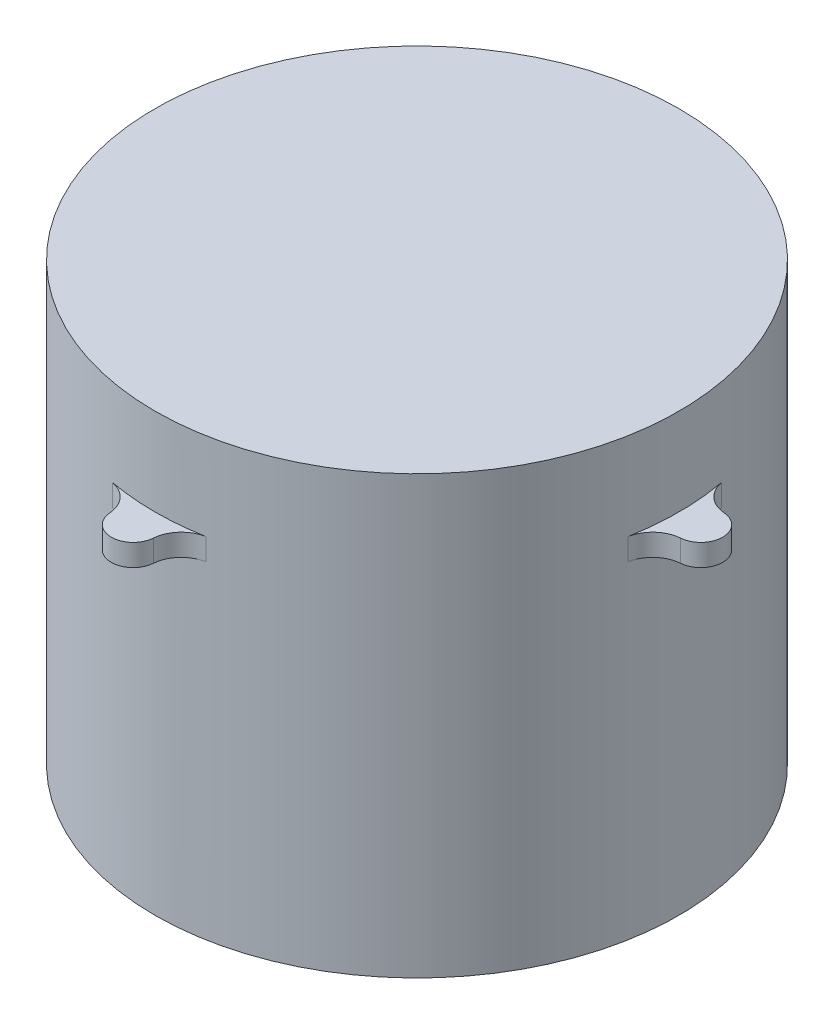
ISO-10303-21;
HEADER;
FILE_DESCRIPTION(('STEP AP214'),'2;1');
FILE_NAME('part.step','',(''),(''),'','','');
FILE_SCHEMA(('AUTOMOTIVE_DESIGN { 1 0 10303 214 1 1 1 1 }'));
ENDSEC;
DATA;
#1=APPLICATION_CONTEXT('core data for automotive mechanical design processes');
#2=APPLICATION_PROTOCOL_DEFINITION('international standard','automotive_design',2000,#1);
#3=PRODUCT_CONTEXT('',#1,'mechanical');
#4=PRODUCT('Part','Part','',(#3));
#5=PRODUCT_RELATED_PRODUCT_CATEGORY('part','',(#4));
#6=PRODUCT_DEFINITION_FORMATION('','',#4);
#7=PRODUCT_DEFINITION_CONTEXT('part definition',#1,'design');
#8=PRODUCT_DEFINITION('design','',#6,#7);
#9=PRODUCT_DEFINITION_SHAPE('','',#8);
#10=(LENGTH_UNIT() NAMED_UNIT(*) SI_UNIT(.MILLI.,.METRE.));
#11=(NAMED_UNIT(*) PLANE_ANGLE_UNIT() SI_UNIT($,.RADIAN.));
#12=(NAMED_UNIT(*) SI_UNIT($,.STERADIAN.) SOLID_ANGLE_UNIT());
#13=UNCERTAINTY_MEASURE_WITH_UNIT(LENGTH_MEASURE(1.E-05),#10,'distance_accuracy_value','');
#14=(GEOMETRIC_REPRESENTATION_CONTEXT(3) GLOBAL_UNCERTAINTY_ASSIGNED_CONTEXT((#13)) GLOBAL_UNIT_ASSIGNED_CONTEXT((#10,
#11,#12)) REPRESENTATION_CONTEXT('',''));
#15=CARTESIAN_POINT('',(0.,0.,0.));
#16=DIRECTION('',(0.,0.,1.));
#17=DIRECTION('',(1.,0.,0.));
#18=AXIS2_PLACEMENT_3D('',#15,#16,#17);
#19=CARTESIAN_POINT('',(0.,100.,0.));
#20=DIRECTION('',(0.,-1.,0.));
#21=DIRECTION('',(0.,0.,-1.));
#22=AXIS2_PLACEMENT_3D('',#19,#20,#21);
#23=CYLINDRICAL_SURFACE('',#22,60.);
#24=CARTESIAN_POINT('',(0.,75.,0.));
#25=DIRECTION('',(0.,1.,0.));
#26=DIRECTION('',(0.,0.,1.));
#27=AXIS2_PLACEMENT_3D('',#24,#25,#26);
#28=CIRCLE('',#27,60.);
#29=CARTESIAN_POINT('',(59.0355912743972,75.,10.7144277907087));
#30=VERTEX_POINT('',#29);
#31=CARTESIAN_POINT('',(59.0355912743972,75.,-10.7144277907088));
#32=VERTEX_POINT('',#31);
#33=EDGE_CURVE('E11',#30,#32,#28,.T.);
#34=ORIENTED_EDGE('',*,*,#33,.F.);
#35=DIRECTION('',(0.,1.,0.));
#36=VECTOR('',#35,1.);
#37=CARTESIAN_POINT('',(59.0355912743972,75.,10.7144277907087));
#38=LINE('',#37,#36);
#39=CARTESIAN_POINT('',(59.0355912743972,80.,10.7144277907087));
#40=VERTEX_POINT('',#39);
#41=EDGE_CURVE('E322',#30,#40,#38,.T.);
#42=ORIENTED_EDGE('',*,*,#41,.T.);
#43=CARTESIAN_POINT('',(0.,80.,0.));
#44=DIRECTION('',(0.,1.,0.));
#45=DIRECTION('',(0.,0.,1.));
#46=AXIS2_PLACEMENT_3D('',#43,#44,#45);
#47=CIRCLE('',#46,60.);
#48=CARTESIAN_POINT('',(59.0355912743972,80.,-10.7144277907088));
#49=VERTEX_POINT('',#48);
#50=EDGE_CURVE('E207',#40,#49,#47,.T.);
#51=ORIENTED_EDGE('',*,*,#50,.T.);
#52=DIRECTION('',(0.,1.,0.));
#53=VECTOR('',#52,1.);
#54=CARTESIAN_POINT('',(59.0355912743972,75.,-10.7144277907088));
#55=LINE('',#54,#53);
#56=EDGE_CURVE('E313',#32,#49,#55,.T.);
#57=ORIENTED_EDGE('',*,*,#56,.F.);
#58=EDGE_LOOP('',(#34,#42,#51,#57));
#59=FACE_BOUND('',#58,.T.);
#60=CARTESIAN_POINT('',(10.7144277907087,75.,-59.0355912743972));
#61=VERTEX_POINT('',#60);
#62=CARTESIAN_POINT('',(-10.7144277907087,75.,-59.0355912743972));
#63=VERTEX_POINT('',#62);
#64=EDGE_CURVE('E54',#61,#63,#28,.T.);
#65=ORIENTED_EDGE('',*,*,#64,.F.);
#66=DIRECTION('',(0.,1.,0.));
#67=VECTOR('',#66,1.);
#68=CARTESIAN_POINT('',(10.7144277907087,75.,-59.0355912743972));
#69=LINE('',#68,#67);
#70=CARTESIAN_POINT('',(10.7144277907087,80.,-59.0355912743972));
#71=VERTEX_POINT('',#70);
#72=EDGE_CURVE('E310',#61,#71,#69,.T.);
#73=ORIENTED_EDGE('',*,*,#72,.T.);
#74=CARTESIAN_POINT('',(-10.7144277907087,80.,-59.0355912743972));
#75=VERTEX_POINT('',#74);
#76=EDGE_CURVE('E183',#71,#75,#47,.T.);
#77=ORIENTED_EDGE('',*,*,#76,.T.);
#78=DIRECTION('',(0.,1.,0.));
#79=VECTOR('',#78,1.);
#80=CARTESIAN_POINT('',(-10.7144277907087,75.,-59.0355912743972));
#81=LINE('',#80,#79);
#82=EDGE_CURVE('E175',#63,#75,#81,.T.);
#83=ORIENTED_EDGE('',*,*,#82,.F.);
#84=EDGE_LOOP('',(#65,#73,#77,#83));
#85=FACE_BOUND('',#84,.T.);
#86=CARTESIAN_POINT('',(-59.0355912743972,75.,-10.7144277907088));
#87=VERTEX_POINT('',#86);
#88=CARTESIAN_POINT('',(-59.0355912743972,75.,10.7144277907088));
#89=VERTEX_POINT('',#88);
#90=EDGE_CURVE('E172',#87,#89,#28,.T.);
#91=ORIENTED_EDGE('',*,*,#90,.F.);
#92=DIRECTION('',(0.,1.,0.));
#93=VECTOR('',#92,1.);
#94=CARTESIAN_POINT('',(-59.0355912743972,75.,-10.7144277907088));
#95=LINE('',#94,#93);
#96=CARTESIAN_POINT('',(-59.0355912743972,80.,-10.7144277907088));
#97=VERTEX_POINT('',#96);
#98=EDGE_CURVE('E185',#87,#97,#95,.T.);
#99=ORIENTED_EDGE('',*,*,#98,.T.);
#100=CARTESIAN_POINT('',(-59.0355912743972,80.,10.7144277907087));
#101=VERTEX_POINT('',#100);
#102=EDGE_CURVE('E206',#97,#101,#47,.T.);
#103=ORIENTED_EDGE('',*,*,#102,.T.);
#104=DIRECTION('',(0.,1.,0.));
#105=VECTOR('',#104,1.);
#106=CARTESIAN_POINT('',(-59.0355912743972,75.,10.7144277907088));
#107=LINE('',#106,#105);
#108=EDGE_CURVE('E241',#89,#101,#107,.T.);
#109=ORIENTED_EDGE('',*,*,#108,.F.);
#110=EDGE_LOOP('',(#91,#99,#103,#109));
#111=FACE_BOUND('',#110,.T.);
#112=CARTESIAN_POINT('',(-10.7144277907088,80.,59.0355912743972));
#113=VERTEX_POINT('',#112);
#114=CARTESIAN_POINT('',(10.7144277907088,80.,59.0355912743972));
#115=VERTEX_POINT('',#114);
#116=EDGE_CURVE('E200',#113,#115,#47,.T.);
#117=ORIENTED_EDGE('',*,*,#116,.T.);
#118=DIRECTION('',(0.,1.,0.));
#119=VECTOR('',#118,1.);
#120=CARTESIAN_POINT('',(10.7144277907088,75.,59.0355912743972));
#121=LINE('',#120,#119);
#122=CARTESIAN_POINT('',(10.7144277907088,75.,59.0355912743972));
#123=VERTEX_POINT('',#122);
#124=EDGE_CURVE('E325',#123,#115,#121,.T.);
#125=ORIENTED_EDGE('',*,*,#124,.F.);
#126=CARTESIAN_POINT('',(-10.7144277907088,75.,59.0355912743972));
#127=VERTEX_POINT('',#126);
#128=EDGE_CURVE('E48',#127,#123,#28,.T.);
#129=ORIENTED_EDGE('',*,*,#128,.F.);
#130=DIRECTION('',(0.,1.,0.));
#131=VECTOR('',#130,1.);
#132=CARTESIAN_POINT('',(-10.7144277907088,75.,59.0355912743972));
#133=LINE('',#132,#131);
#134=EDGE_CURVE('E248',#127,#113,#133,.T.);
#135=ORIENTED_EDGE('',*,*,#134,.T.);
#136=EDGE_LOOP('',(#117,#125,#129,#135));
#137=FACE_BOUND('',#136,.T.);
#138=CARTESIAN_POINT('',(0.,100.,0.));
#139=DIRECTION('',(0.,1.,0.));
#140=DIRECTION('',(0.,0.,1.));
#141=AXIS2_PLACEMENT_3D('',#138,#139,#140);
#142=CIRCLE('',#141,60.);
#143=CARTESIAN_POINT('',(0.,100.,60.));
#144=VERTEX_POINT('',#143);
#145=EDGE_CURVE('E196',#144,#144,#142,.T.);
#146=ORIENTED_EDGE('',*,*,#145,.F.);
#147=EDGE_LOOP('',(#146));
#148=FACE_BOUND('',#147,.T.);
#149=CARTESIAN_POINT('',(0.,0.,0.));
#150=DIRECTION('',(0.,1.,0.));
#151=DIRECTION('',(0.,0.,1.));
#152=AXIS2_PLACEMENT_3D('',#149,#150,#151);
#153=CIRCLE('',#152,60.);
#154=CARTESIAN_POINT('',(0.,0.,60.));
#155=VERTEX_POINT('',#154);
#156=EDGE_CURVE('E201',#155,#155,#153,.T.);
#157=ORIENTED_EDGE('',*,*,#156,.T.);
#158=EDGE_LOOP('',(#157));
#159=FACE_BOUND('',#158,.T.);
#160=ADVANCED_FACE('F45',(#59,#85,#111,#137,#148,#159),#23,.T.);
#161=CARTESIAN_POINT('',(0.,100.,0.));
#162=DIRECTION('',(0.,1.,0.));
#163=DIRECTION('',(0.,0.,1.));
#164=AXIS2_PLACEMENT_3D('',#161,#162,#163);
#165=PLANE('',#164);
#166=ORIENTED_EDGE('',*,*,#145,.T.);
#167=EDGE_LOOP('',(#166));
#168=FACE_BOUND('',#167,.T.);
#169=ADVANCED_FACE('F393',(#168),#165,.T.);
#170=CARTESIAN_POINT('',(0.,0.,0.));
#171=DIRECTION('',(0.,1.,0.));
#172=DIRECTION('',(0.,0.,1.));
#173=AXIS2_PLACEMENT_3D('',#170,#171,#172);
#174=PLANE('',#173);
#175=ORIENTED_EDGE('',*,*,#156,.F.);
#176=EDGE_LOOP('',(#175));
#177=FACE_BOUND('',#176,.T.);
#178=ADVANCED_FACE('F399',(#177),#174,.F.);
#179=CARTESIAN_POINT('',(0.,75.,65.));
#180=DIRECTION('',(0.,1.,0.));
#181=DIRECTION('',(0.,0.,1.));
#182=AXIS2_PLACEMENT_3D('',#179,#180,#181);
#183=CYLINDRICAL_SURFACE('',#182,5.);
#184=CARTESIAN_POINT('',(0.,80.,65.));
#185=DIRECTION('',(0.,1.,0.));
#186=DIRECTION('',(0.,0.,1.));
#187=AXIS2_PLACEMENT_3D('',#184,#185,#186);
#188=CIRCLE('',#187,5.);
#189=CARTESIAN_POINT('',(-4.98518515262142,80.,65.3846153846154));
#190=VERTEX_POINT('',#189);
#191=CARTESIAN_POINT('',(4.98518515262144,80.,65.3846153846154));
#192=VERTEX_POINT('',#191);
#193=EDGE_CURVE('E283',#190,#192,#188,.T.);
#194=ORIENTED_EDGE('',*,*,#193,.F.);
#195=DIRECTION('',(0.,1.,0.));
#196=VECTOR('',#195,1.);
#197=CARTESIAN_POINT('',(-4.98518515262142,75.,65.3846153846154));
#198=LINE('',#197,#196);
#199=CARTESIAN_POINT('',(-4.98518515262142,75.,65.3846153846154));
#200=VERTEX_POINT('',#199);
#201=EDGE_CURVE('E252',#200,#190,#198,.T.);
#202=ORIENTED_EDGE('',*,*,#201,.F.);
#203=CARTESIAN_POINT('',(0.,75.,65.));
#204=DIRECTION('',(0.,1.,0.));
#205=DIRECTION('',(0.,0.,1.));
#206=AXIS2_PLACEMENT_3D('',#203,#204,#205);
#207=CIRCLE('',#206,5.);
#208=CARTESIAN_POINT('',(4.98518515262144,75.,65.3846153846154));
#209=VERTEX_POINT('',#208);
#210=EDGE_CURVE('E349',#200,#209,#207,.T.);
#211=ORIENTED_EDGE('',*,*,#210,.T.);
#212=DIRECTION('',(0.,1.,0.));
#213=VECTOR('',#212,1.);
#214=CARTESIAN_POINT('',(4.98518515262144,75.,65.3846153846154));
#215=LINE('',#214,#213);
#216=EDGE_CURVE('E329',#209,#192,#215,.T.);
#217=ORIENTED_EDGE('',*,*,#216,.T.);
#218=EDGE_LOOP('',(#194,#202,#211,#217));
#219=FACE_BOUND('',#218,.T.);
#220=ADVANCED_FACE('F340',(#219),#183,.T.);
#221=CARTESIAN_POINT('',(-5.98222218314572,75.,-65.4615384615385));
#222=DIRECTION('',(0.,1.,0.));
#223=DIRECTION('',(0.,0.,1.));
#224=AXIS2_PLACEMENT_3D('',#221,#222,#223);
#225=PLANE('',#224);
#226=CARTESIAN_POINT('',(-11.9644443662914,75.,65.9230769230769));
#227=DIRECTION('',(0.,-1.,0.));
#228=DIRECTION('',(0.,0.,1.));
#229=AXIS2_PLACEMENT_3D('',#226,#227,#228);
#230=CIRCLE('',#229,7.);
#231=EDGE_CURVE('E244',#127,#200,#230,.T.);
#232=ORIENTED_EDGE('',*,*,#231,.F.);
#233=ORIENTED_EDGE('',*,*,#128,.T.);
#234=CARTESIAN_POINT('',(11.9644443662914,75.,65.9230769230769));
#235=DIRECTION('',(0.,-1.,0.));
#236=DIRECTION('',(0.,0.,1.));
#237=AXIS2_PLACEMENT_3D('',#234,#235,#236);
#238=CIRCLE('',#237,7.);
#239=EDGE_CURVE('E346',#209,#123,#238,.T.);
#240=ORIENTED_EDGE('',*,*,#239,.F.);
#241=ORIENTED_EDGE('',*,*,#210,.F.);
#242=EDGE_LOOP('',(#232,#233,#240,#241));
#243=FACE_BOUND('',#242,.T.);
#244=ADVANCED_FACE('F348',(#243),#225,.F.);
#245=CARTESIAN_POINT('',(-5.98222218314572,80.,-65.4615384615385));
#246=DIRECTION('',(0.,1.,0.));
#247=DIRECTION('',(0.,0.,1.));
#248=AXIS2_PLACEMENT_3D('',#245,#246,#247);
#249=PLANE('',#248);
#250=ORIENTED_EDGE('',*,*,#116,.F.);
#251=CARTESIAN_POINT('',(-11.9644443662914,80.,65.9230769230769));
#252=DIRECTION('',(0.,-1.,0.));
#253=DIRECTION('',(0.,0.,1.));
#254=AXIS2_PLACEMENT_3D('',#251,#252,#253);
#255=CIRCLE('',#254,7.);
#256=EDGE_CURVE('E279',#113,#190,#255,.T.);
#257=ORIENTED_EDGE('',*,*,#256,.T.);
#258=ORIENTED_EDGE('',*,*,#193,.T.);
#259=CARTESIAN_POINT('',(11.9644443662914,80.,65.9230769230769));
#260=DIRECTION('',(0.,-1.,0.));
#261=DIRECTION('',(0.,0.,1.));
#262=AXIS2_PLACEMENT_3D('',#259,#260,#261);
#263=CIRCLE('',#262,7.);
#264=EDGE_CURVE('E287',#192,#115,#263,.T.);
#265=ORIENTED_EDGE('',*,*,#264,.T.);
#266=EDGE_LOOP('',(#250,#257,#258,#265));
#267=FACE_BOUND('',#266,.T.);
#268=ADVANCED_FACE('F343',(#267),#249,.T.);
#269=CARTESIAN_POINT('',(-11.9644443662914,75.,65.9230769230769));
#270=DIRECTION('',(0.,1.,0.));
#271=DIRECTION('',(0.,0.,1.));
#272=AXIS2_PLACEMENT_3D('',#269,#270,#271);
#273=CYLINDRICAL_SURFACE('',#272,7.);
#274=ORIENTED_EDGE('',*,*,#256,.F.);
#275=ORIENTED_EDGE('',*,*,#134,.F.);
#276=ORIENTED_EDGE('',*,*,#231,.T.);
#277=ORIENTED_EDGE('',*,*,#201,.T.);
#278=EDGE_LOOP('',(#274,#275,#276,#277));
#279=FACE_BOUND('',#278,.T.);
#280=ADVANCED_FACE('F336',(#279),#273,.F.);
#281=CARTESIAN_POINT('',(11.9644443662914,75.,65.9230769230769));
#282=DIRECTION('',(0.,1.,0.));
#283=DIRECTION('',(0.,0.,1.));
#284=AXIS2_PLACEMENT_3D('',#281,#282,#283);
#285=CYLINDRICAL_SURFACE('',#284,7.);
#286=ORIENTED_EDGE('',*,*,#264,.F.);
#287=ORIENTED_EDGE('',*,*,#216,.F.);
#288=ORIENTED_EDGE('',*,*,#239,.T.);
#289=ORIENTED_EDGE('',*,*,#124,.T.);
#290=EDGE_LOOP('',(#286,#287,#288,#289));
#291=FACE_BOUND('',#290,.T.);
#292=ADVANCED_FACE('F345',(#291),#285,.F.);
#293=CARTESIAN_POINT('',(-65.,75.,0.));
#294=DIRECTION('',(0.,1.,0.));
#295=DIRECTION('',(0.,0.,1.));
#296=AXIS2_PLACEMENT_3D('',#293,#294,#295);
#297=CYLINDRICAL_SURFACE('',#296,5.);
#298=CARTESIAN_POINT('',(-65.,80.,0.));
#299=DIRECTION('',(0.,1.,0.));
#300=DIRECTION('',(0.,0.,1.));
#301=AXIS2_PLACEMENT_3D('',#298,#299,#300);
#302=CIRCLE('',#301,5.);
#303=CARTESIAN_POINT('',(-65.3846153846154,80.,-4.98518515262144));
#304=VERTEX_POINT('',#303);
#305=CARTESIAN_POINT('',(-65.3846153846154,80.,4.98518515262142));
#306=VERTEX_POINT('',#305);
#307=EDGE_CURVE('E265',#304,#306,#302,.T.);
#308=ORIENTED_EDGE('',*,*,#307,.F.);
#309=DIRECTION('',(0.,1.,0.));
#310=VECTOR('',#309,1.);
#311=CARTESIAN_POINT('',(-65.3846153846154,75.,-4.98518515262144));
#312=LINE('',#311,#310);
#313=CARTESIAN_POINT('',(-65.3846153846154,75.,-4.98518515262144));
#314=VERTEX_POINT('',#313);
#315=EDGE_CURVE('E191',#314,#304,#312,.T.);
#316=ORIENTED_EDGE('',*,*,#315,.F.);
#317=CARTESIAN_POINT('',(-65.,75.,0.));
#318=DIRECTION('',(0.,1.,0.));
#319=DIRECTION('',(0.,0.,1.));
#320=AXIS2_PLACEMENT_3D('',#317,#318,#319);
#321=CIRCLE('',#320,5.);
#322=CARTESIAN_POINT('',(-65.3846153846154,75.,4.98518515262142));
#323=VERTEX_POINT('',#322);
#324=EDGE_CURVE('E245',#314,#323,#321,.T.);
#325=ORIENTED_EDGE('',*,*,#324,.T.);
#326=DIRECTION('',(0.,1.,0.));
#327=VECTOR('',#326,1.);
#328=CARTESIAN_POINT('',(-65.3846153846154,75.,4.98518515262142));
#329=LINE('',#328,#327);
#330=EDGE_CURVE('E242',#323,#306,#329,.T.);
#331=ORIENTED_EDGE('',*,*,#330,.T.);
#332=EDGE_LOOP('',(#308,#316,#325,#331));
#333=FACE_BOUND('',#332,.T.);
#334=ADVANCED_FACE('F266',(#333),#297,.T.);
#335=CARTESIAN_POINT('',(-65.9230769230769,75.,-11.9644443662914));
#336=DIRECTION('',(0.,-1.,0.));
#337=DIRECTION('',(0.,0.,1.));
#338=AXIS2_PLACEMENT_3D('',#335,#336,#337);
#339=CIRCLE('',#338,7.00000000000001);
#340=EDGE_CURVE('E179',#87,#314,#339,.T.);
#341=ORIENTED_EDGE('',*,*,#340,.F.);
#342=ORIENTED_EDGE('',*,*,#90,.T.);
#343=CARTESIAN_POINT('',(-65.9230769230769,75.,11.9644443662914));
#344=DIRECTION('',(0.,-1.,0.));
#345=DIRECTION('',(0.,0.,1.));
#346=AXIS2_PLACEMENT_3D('',#343,#344,#345);
#347=CIRCLE('',#346,6.99999999999999);
#348=EDGE_CURVE('E233',#323,#89,#347,.T.);
#349=ORIENTED_EDGE('',*,*,#348,.F.);
#350=ORIENTED_EDGE('',*,*,#324,.F.);
#351=EDGE_LOOP('',(#341,#342,#349,#350));
#352=FACE_BOUND('',#351,.T.);
#353=ADVANCED_FACE('F231',(#352),#225,.F.);
#354=ORIENTED_EDGE('',*,*,#102,.F.);
#355=CARTESIAN_POINT('',(-65.9230769230769,80.,-11.9644443662914));
#356=DIRECTION('',(0.,-1.,0.));
#357=DIRECTION('',(0.,0.,1.));
#358=AXIS2_PLACEMENT_3D('',#355,#356,#357);
#359=CIRCLE('',#358,7.00000000000001);
#360=EDGE_CURVE('E262',#97,#304,#359,.T.);
#361=ORIENTED_EDGE('',*,*,#360,.T.);
#362=ORIENTED_EDGE('',*,*,#307,.T.);
#363=CARTESIAN_POINT('',(-65.9230769230769,80.,11.9644443662914));
#364=DIRECTION('',(0.,-1.,0.));
#365=DIRECTION('',(0.,0.,1.));
#366=AXIS2_PLACEMENT_3D('',#363,#364,#365);
#367=CIRCLE('',#366,6.99999999999999);
#368=EDGE_CURVE('E269',#306,#101,#367,.T.);
#369=ORIENTED_EDGE('',*,*,#368,.T.);
#370=EDGE_LOOP('',(#354,#361,#362,#369));
#371=FACE_BOUND('',#370,.T.);
#372=ADVANCED_FACE('F271',(#371),#249,.T.);
#373=CARTESIAN_POINT('',(-65.9230769230769,75.,-11.9644443662914));
#374=DIRECTION('',(0.,1.,0.));
#375=DIRECTION('',(0.,0.,1.));
#376=AXIS2_PLACEMENT_3D('',#373,#374,#375);
#377=CYLINDRICAL_SURFACE('',#376,7.00000000000001);
#378=ORIENTED_EDGE('',*,*,#360,.F.);
#379=ORIENTED_EDGE('',*,*,#98,.F.);
#380=ORIENTED_EDGE('',*,*,#340,.T.);
#381=ORIENTED_EDGE('',*,*,#315,.T.);
#382=EDGE_LOOP('',(#378,#379,#380,#381));
#383=FACE_BOUND('',#382,.T.);
#384=ADVANCED_FACE('F260',(#383),#377,.F.);
#385=CARTESIAN_POINT('',(-65.9230769230769,75.,11.9644443662914));
#386=DIRECTION('',(0.,1.,0.));
#387=DIRECTION('',(0.,0.,1.));
#388=AXIS2_PLACEMENT_3D('',#385,#386,#387);
#389=CYLINDRICAL_SURFACE('',#388,6.99999999999999);
#390=ORIENTED_EDGE('',*,*,#368,.F.);
#391=ORIENTED_EDGE('',*,*,#330,.F.);
#392=ORIENTED_EDGE('',*,*,#348,.T.);
#393=ORIENTED_EDGE('',*,*,#108,.T.);
#394=EDGE_LOOP('',(#390,#391,#392,#393));
#395=FACE_BOUND('',#394,.T.);
#396=ADVANCED_FACE('F240',(#395),#389,.F.);
#397=CARTESIAN_POINT('',(0.,75.,-65.));
#398=DIRECTION('',(0.,1.,0.));
#399=DIRECTION('',(0.,0.,1.));
#400=AXIS2_PLACEMENT_3D('',#397,#398,#399);
#401=CYLINDRICAL_SURFACE('',#400,5.);
#402=CARTESIAN_POINT('',(0.,80.,-65.));
#403=DIRECTION('',(0.,1.,0.));
#404=DIRECTION('',(0.,0.,1.));
#405=AXIS2_PLACEMENT_3D('',#402,#403,#404);
#406=CIRCLE('',#405,5.);
#407=CARTESIAN_POINT('',(4.98518515262143,80.,-65.3846153846154));
#408=VERTEX_POINT('',#407);
#409=CARTESIAN_POINT('',(-4.98518515262143,80.,-65.3846153846154));
#410=VERTEX_POINT('',#409);
#411=EDGE_CURVE('E180',#408,#410,#406,.T.);
#412=ORIENTED_EDGE('',*,*,#411,.F.);
#413=DIRECTION('',(0.,1.,0.));
#414=VECTOR('',#413,1.);
#415=CARTESIAN_POINT('',(4.98518515262143,75.,-65.3846153846154));
#416=LINE('',#415,#414);
#417=CARTESIAN_POINT('',(4.98518515262143,75.,-65.3846153846154));
#418=VERTEX_POINT('',#417);
#419=EDGE_CURVE('E307',#418,#408,#416,.T.);
#420=ORIENTED_EDGE('',*,*,#419,.F.);
#421=CARTESIAN_POINT('',(0.,75.,-65.));
#422=DIRECTION('',(0.,1.,0.));
#423=DIRECTION('',(0.,0.,1.));
#424=AXIS2_PLACEMENT_3D('',#421,#422,#423);
#425=CIRCLE('',#424,5.);
#426=CARTESIAN_POINT('',(-4.98518515262143,75.,-65.3846153846154));
#427=VERTEX_POINT('',#426);
#428=EDGE_CURVE('E186',#418,#427,#425,.T.);
#429=ORIENTED_EDGE('',*,*,#428,.T.);
#430=DIRECTION('',(0.,1.,0.));
#431=VECTOR('',#430,1.);
#432=CARTESIAN_POINT('',(-4.98518515262143,75.,-65.3846153846154));
#433=LINE('',#432,#431);
#434=EDGE_CURVE('E177',#427,#410,#433,.T.);
#435=ORIENTED_EDGE('',*,*,#434,.T.);
#436=EDGE_LOOP('',(#412,#420,#429,#435));
#437=FACE_BOUND('',#436,.T.);
#438=ADVANCED_FACE('F376',(#437),#401,.T.);
#439=CARTESIAN_POINT('',(11.9644443662914,75.,-65.9230769230769));
#440=DIRECTION('',(0.,-1.,0.));
#441=DIRECTION('',(0.,0.,1.));
#442=AXIS2_PLACEMENT_3D('',#439,#440,#441);
#443=CIRCLE('',#442,7.);
#444=EDGE_CURVE('E167',#61,#418,#443,.T.);
#445=ORIENTED_EDGE('',*,*,#444,.F.);
#446=ORIENTED_EDGE('',*,*,#64,.T.);
#447=CARTESIAN_POINT('',(-11.9644443662914,75.,-65.9230769230769));
#448=DIRECTION('',(0.,-1.,0.));
#449=DIRECTION('',(0.,0.,1.));
#450=AXIS2_PLACEMENT_3D('',#447,#448,#449);
#451=CIRCLE('',#450,7.);
#452=EDGE_CURVE('E164',#427,#63,#451,.T.);
#453=ORIENTED_EDGE('',*,*,#452,.F.);
#454=ORIENTED_EDGE('',*,*,#428,.F.);
#455=EDGE_LOOP('',(#445,#446,#453,#454));
#456=FACE_BOUND('',#455,.T.);
#457=ADVANCED_FACE('F162',(#456),#225,.F.);
#458=ORIENTED_EDGE('',*,*,#76,.F.);
#459=CARTESIAN_POINT('',(11.9644443662914,80.,-65.9230769230769));
#460=DIRECTION('',(0.,-1.,0.));
#461=DIRECTION('',(0.,0.,1.));
#462=AXIS2_PLACEMENT_3D('',#459,#460,#461);
#463=CIRCLE('',#462,7.);
#464=EDGE_CURVE('E299',#71,#408,#463,.T.);
#465=ORIENTED_EDGE('',*,*,#464,.T.);
#466=ORIENTED_EDGE('',*,*,#411,.T.);
#467=CARTESIAN_POINT('',(-11.9644443662914,80.,-65.9230769230769));
#468=DIRECTION('',(0.,-1.,0.));
#469=DIRECTION('',(0.,0.,1.));
#470=AXIS2_PLACEMENT_3D('',#467,#468,#469);
#471=CIRCLE('',#470,7.);
#472=EDGE_CURVE('E69',#410,#75,#471,.T.);
#473=ORIENTED_EDGE('',*,*,#472,.T.);
#474=EDGE_LOOP('',(#458,#465,#466,#473));
#475=FACE_BOUND('',#474,.T.);
#476=ADVANCED_FACE('F377',(#475),#249,.T.);
#477=CARTESIAN_POINT('',(11.9644443662914,75.,-65.9230769230769));
#478=DIRECTION('',(0.,1.,0.));
#479=DIRECTION('',(0.,0.,1.));
#480=AXIS2_PLACEMENT_3D('',#477,#478,#479);
#481=CYLINDRICAL_SURFACE('',#480,7.);
#482=ORIENTED_EDGE('',*,*,#464,.F.);
#483=ORIENTED_EDGE('',*,*,#72,.F.);
#484=ORIENTED_EDGE('',*,*,#444,.T.);
#485=ORIENTED_EDGE('',*,*,#419,.T.);
#486=EDGE_LOOP('',(#482,#483,#484,#485));
#487=FACE_BOUND('',#486,.T.);
#488=ADVANCED_FACE('F373',(#487),#481,.F.);
#489=CARTESIAN_POINT('',(-11.9644443662914,75.,-65.9230769230769));
#490=DIRECTION('',(0.,1.,0.));
#491=DIRECTION('',(0.,0.,1.));
#492=AXIS2_PLACEMENT_3D('',#489,#490,#491);
#493=CYLINDRICAL_SURFACE('',#492,7.);
#494=ORIENTED_EDGE('',*,*,#472,.F.);
#495=ORIENTED_EDGE('',*,*,#434,.F.);
#496=ORIENTED_EDGE('',*,*,#452,.T.);
#497=ORIENTED_EDGE('',*,*,#82,.T.);
#498=EDGE_LOOP('',(#494,#495,#496,#497));
#499=FACE_BOUND('',#498,.T.);
#500=ADVANCED_FACE('F174',(#499),#493,.F.);
#501=CARTESIAN_POINT('',(65.9230769230769,75.,11.9644443662914));
#502=DIRECTION('',(0.,-1.,0.));
#503=DIRECTION('',(0.,0.,1.));
#504=AXIS2_PLACEMENT_3D('',#501,#502,#503);
#505=CIRCLE('',#504,7.00000000000001);
#506=CARTESIAN_POINT('',(65.3846153846154,75.,4.98518515262141));
#507=VERTEX_POINT('',#506);
#508=EDGE_CURVE('E358',#30,#507,#505,.T.);
#509=ORIENTED_EDGE('',*,*,#508,.F.);
#510=ORIENTED_EDGE('',*,*,#33,.T.);
#511=CARTESIAN_POINT('',(65.9230769230769,75.,-11.9644443662914));
#512=DIRECTION('',(0.,-1.,0.));
#513=DIRECTION('',(0.,0.,1.));
#514=AXIS2_PLACEMENT_3D('',#511,#512,#513);
#515=CIRCLE('',#514,7.);
#516=CARTESIAN_POINT('',(65.3846153846154,75.,-4.98518515262144));
#517=VERTEX_POINT('',#516);
#518=EDGE_CURVE('E366',#517,#32,#515,.T.);
#519=ORIENTED_EDGE('',*,*,#518,.F.);
#520=CARTESIAN_POINT('',(65.,75.,0.));
#521=DIRECTION('',(0.,1.,0.));
#522=DIRECTION('',(0.,0.,1.));
#523=AXIS2_PLACEMENT_3D('',#520,#521,#522);
#524=CIRCLE('',#523,5.);
#525=EDGE_CURVE('E362',#507,#517,#524,.T.);
#526=ORIENTED_EDGE('',*,*,#525,.F.);
#527=EDGE_LOOP('',(#509,#510,#519,#526));
#528=FACE_BOUND('',#527,.T.);
#529=ADVANCED_FACE('F387',(#528),#225,.F.);
#530=ORIENTED_EDGE('',*,*,#50,.F.);
#531=CARTESIAN_POINT('',(65.9230769230769,80.,11.9644443662914));
#532=DIRECTION('',(0.,-1.,0.));
#533=DIRECTION('',(0.,0.,1.));
#534=AXIS2_PLACEMENT_3D('',#531,#532,#533);
#535=CIRCLE('',#534,7.00000000000001);
#536=CARTESIAN_POINT('',(65.3846153846154,80.,4.98518515262141));
#537=VERTEX_POINT('',#536);
#538=EDGE_CURVE('E290',#40,#537,#535,.T.);
#539=ORIENTED_EDGE('',*,*,#538,.T.);
#540=CARTESIAN_POINT('',(65.,80.,0.));
#541=DIRECTION('',(0.,1.,0.));
#542=DIRECTION('',(0.,0.,1.));
#543=AXIS2_PLACEMENT_3D('',#540,#541,#542);
#544=CIRCLE('',#543,5.);
#545=CARTESIAN_POINT('',(65.3846153846154,80.,-4.98518515262144));
#546=VERTEX_POINT('',#545);
#547=EDGE_CURVE('E294',#537,#546,#544,.T.);
#548=ORIENTED_EDGE('',*,*,#547,.T.);
#549=CARTESIAN_POINT('',(65.9230769230769,80.,-11.9644443662914));
#550=DIRECTION('',(0.,-1.,0.));
#551=DIRECTION('',(0.,0.,1.));
#552=AXIS2_PLACEMENT_3D('',#549,#550,#551);
#553=CIRCLE('',#552,7.);
#554=EDGE_CURVE('E61',#546,#49,#553,.T.);
#555=ORIENTED_EDGE('',*,*,#554,.T.);
#556=EDGE_LOOP('',(#530,#539,#548,#555));
#557=FACE_BOUND('',#556,.T.);
#558=ADVANCED_FACE('F380',(#557),#249,.T.);
#559=CARTESIAN_POINT('',(65.9230769230769,75.,-11.9644443662914));
#560=DIRECTION('',(0.,1.,0.));
#561=DIRECTION('',(0.,0.,1.));
#562=AXIS2_PLACEMENT_3D('',#559,#560,#561);
#563=CYLINDRICAL_SURFACE('',#562,7.);
#564=ORIENTED_EDGE('',*,*,#554,.F.);
#565=DIRECTION('',(0.,1.,0.));
#566=VECTOR('',#565,1.);
#567=CARTESIAN_POINT('',(65.3846153846154,75.,-4.98518515262144));
#568=LINE('',#567,#566);
#569=EDGE_CURVE('E316',#517,#546,#568,.T.);
#570=ORIENTED_EDGE('',*,*,#569,.F.);
#571=ORIENTED_EDGE('',*,*,#518,.T.);
#572=ORIENTED_EDGE('',*,*,#56,.T.);
#573=EDGE_LOOP('',(#564,#570,#571,#572));
#574=FACE_BOUND('',#573,.T.);
#575=ADVANCED_FACE('F391',(#574),#563,.F.);
#576=CARTESIAN_POINT('',(65.,75.,0.));
#577=DIRECTION('',(0.,1.,0.));
#578=DIRECTION('',(0.,0.,1.));
#579=AXIS2_PLACEMENT_3D('',#576,#577,#578);
#580=CYLINDRICAL_SURFACE('',#579,5.);
#581=ORIENTED_EDGE('',*,*,#547,.F.);
#582=DIRECTION('',(0.,1.,0.));
#583=VECTOR('',#582,1.);
#584=CARTESIAN_POINT('',(65.3846153846154,75.,4.98518515262141));
#585=LINE('',#584,#583);
#586=EDGE_CURVE('E319',#507,#537,#585,.T.);
#587=ORIENTED_EDGE('',*,*,#586,.F.);
#588=ORIENTED_EDGE('',*,*,#525,.T.);
#589=ORIENTED_EDGE('',*,*,#569,.T.);
#590=EDGE_LOOP('',(#581,#587,#588,#589));
#591=FACE_BOUND('',#590,.T.);
#592=ADVANCED_FACE('F410',(#591),#580,.T.);
#593=CARTESIAN_POINT('',(65.9230769230769,75.,11.9644443662914));
#594=DIRECTION('',(0.,1.,0.));
#595=DIRECTION('',(0.,0.,1.));
#596=AXIS2_PLACEMENT_3D('',#593,#594,#595);
#597=CYLINDRICAL_SURFACE('',#596,7.00000000000001);
#598=ORIENTED_EDGE('',*,*,#538,.F.);
#599=ORIENTED_EDGE('',*,*,#41,.F.);
#600=ORIENTED_EDGE('',*,*,#508,.T.);
#601=ORIENTED_EDGE('',*,*,#586,.T.);
#602=EDGE_LOOP('',(#598,#599,#600,#601));
#603=FACE_BOUND('',#602,.T.);
#604=ADVANCED_FACE('F413',(#603),#597,.F.);
#605=CLOSED_SHELL('',(#160,#169,#178,#220,#244,#268,#280,#292,#334,#353,#372,#384,#396,#438,
#457,#476,#488,#500,#529,#558,#575,#592,#604));
#606=MANIFOLD_SOLID_BREP('B2',#605);
#607=ADVANCED_BREP_SHAPE_REPRESENTATION('',(#18,#606),#14);
#608=SHAPE_DEFINITION_REPRESENTATION(#9,#607);
ENDSEC;
END-ISO-10303-21;
